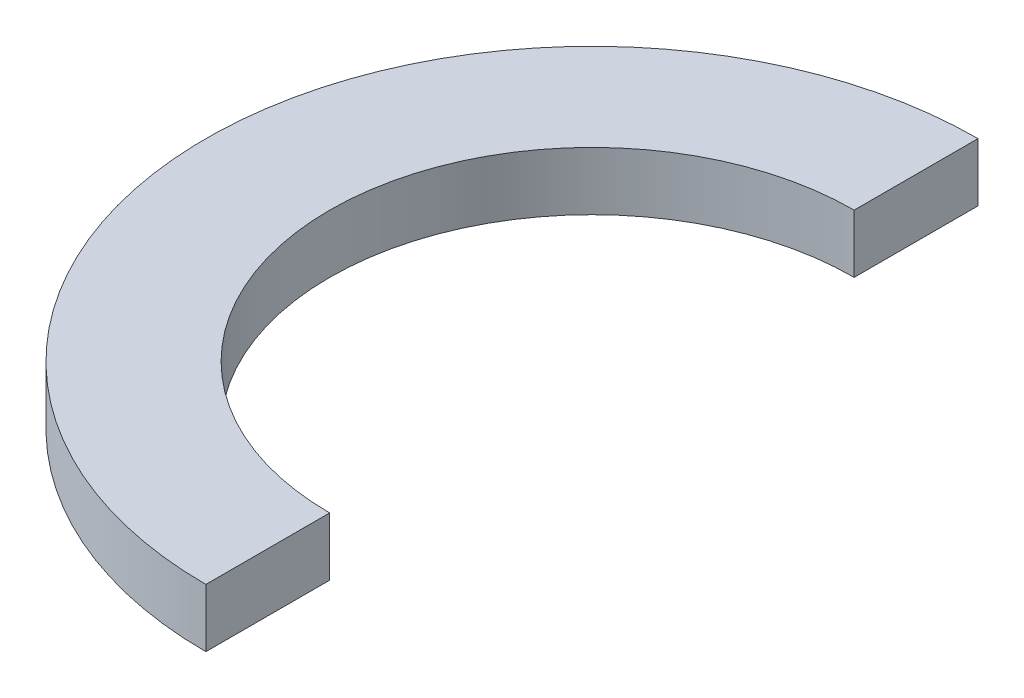
ISO-10303-21;
HEADER;
FILE_DESCRIPTION(('STEP AP214'),'2;1');
FILE_NAME('part.step','',(''),(''),'','','');
FILE_SCHEMA(('AUTOMOTIVE_DESIGN { 1 0 10303 214 1 1 1 1 }'));
ENDSEC;
DATA;
#1=APPLICATION_CONTEXT('core data for automotive mechanical design processes');
#2=APPLICATION_PROTOCOL_DEFINITION('international standard','automotive_design',2000,#1);
#3=PRODUCT_CONTEXT('',#1,'mechanical');
#4=PRODUCT('Part','Part','',(#3));
#5=PRODUCT_RELATED_PRODUCT_CATEGORY('part','',(#4));
#6=PRODUCT_DEFINITION_FORMATION('','',#4);
#7=PRODUCT_DEFINITION_CONTEXT('part definition',#1,'design');
#8=PRODUCT_DEFINITION('design','',#6,#7);
#9=PRODUCT_DEFINITION_SHAPE('','',#8);
#10=(LENGTH_UNIT() NAMED_UNIT(*) SI_UNIT(.MILLI.,.METRE.));
#11=(NAMED_UNIT(*) PLANE_ANGLE_UNIT() SI_UNIT($,.RADIAN.));
#12=(NAMED_UNIT(*) SI_UNIT($,.STERADIAN.) SOLID_ANGLE_UNIT());
#13=UNCERTAINTY_MEASURE_WITH_UNIT(LENGTH_MEASURE(1.E-05),#10,'distance_accuracy_value','');
#14=(GEOMETRIC_REPRESENTATION_CONTEXT(3) GLOBAL_UNCERTAINTY_ASSIGNED_CONTEXT((#13)) GLOBAL_UNIT_ASSIGNED_CONTEXT((#10,
#11,#12)) REPRESENTATION_CONTEXT('',''));
#15=CARTESIAN_POINT('',(0.,0.,0.));
#16=DIRECTION('',(0.,0.,1.));
#17=DIRECTION('',(1.,0.,0.));
#18=AXIS2_PLACEMENT_3D('',#15,#16,#17);
#19=CARTESIAN_POINT('',(65.,143.,100.));
#20=DIRECTION('',(0.,1.,0.));
#21=DIRECTION('',(1.,0.,0.));
#22=AXIS2_PLACEMENT_3D('',#19,#20,#21);
#23=CYLINDRICAL_SURFACE('',#22,3.6);
#24=CARTESIAN_POINT('',(65.,143.9,100.));
#25=DIRECTION('',(0.,-1.,0.));
#26=DIRECTION('',(1.,0.,0.));
#27=AXIS2_PLACEMENT_3D('',#24,#25,#26);
#28=CIRCLE('',#27,3.6);
#29=CARTESIAN_POINT('',(65.,143.9,103.6));
#30=VERTEX_POINT('',#29);
#31=CARTESIAN_POINT('',(65.,143.9,96.4));
#32=VERTEX_POINT('',#31);
#33=EDGE_CURVE('E72',#30,#32,#28,.T.);
#34=ORIENTED_EDGE('',*,*,#33,.F.);
#35=DIRECTION('',(0.,1.,0.));
#36=VECTOR('',#35,1.);
#37=CARTESIAN_POINT('',(65.,143.,103.6));
#38=LINE('',#37,#36);
#39=CARTESIAN_POINT('',(65.,143.1,103.6));
#40=VERTEX_POINT('',#39);
#41=EDGE_CURVE('E11',#40,#30,#38,.T.);
#42=ORIENTED_EDGE('',*,*,#41,.F.);
#43=CARTESIAN_POINT('',(65.,143.1,100.));
#44=DIRECTION('',(0.,-1.,0.));
#45=DIRECTION('',(1.,0.,0.));
#46=AXIS2_PLACEMENT_3D('',#43,#44,#45);
#47=CIRCLE('',#46,3.6);
#48=CARTESIAN_POINT('',(65.,143.1,96.4));
#49=VERTEX_POINT('',#48);
#50=EDGE_CURVE('E25',#40,#49,#47,.T.);
#51=ORIENTED_EDGE('',*,*,#50,.T.);
#52=DIRECTION('',(0.,1.,0.));
#53=VECTOR('',#52,1.);
#54=CARTESIAN_POINT('',(65.,143.,96.4));
#55=LINE('',#54,#53);
#56=EDGE_CURVE('E77',#49,#32,#55,.T.);
#57=ORIENTED_EDGE('',*,*,#56,.T.);
#58=EDGE_LOOP('',(#34,#42,#51,#57));
#59=FACE_BOUND('',#58,.T.);
#60=ADVANCED_FACE('F16',(#59),#23,.F.);
#61=CARTESIAN_POINT('',(65.,144.5,94.));
#62=DIRECTION('',(1.,0.,0.));
#63=DIRECTION('',(0.,1.,0.));
#64=AXIS2_PLACEMENT_3D('',#61,#62,#63);
#65=PLANE('',#64);
#66=ORIENTED_EDGE('',*,*,#41,.T.);
#67=DIRECTION('',(0.,0.,1.));
#68=VECTOR('',#67,1.);
#69=CARTESIAN_POINT('',(65.,143.9,97.));
#70=LINE('',#69,#68);
#71=CARTESIAN_POINT('',(65.,143.9,105.3));
#72=VERTEX_POINT('',#71);
#73=EDGE_CURVE('E66',#30,#72,#70,.T.);
#74=ORIENTED_EDGE('',*,*,#73,.T.);
#75=DIRECTION('',(0.,1.,0.));
#76=VECTOR('',#75,1.);
#77=CARTESIAN_POINT('',(65.,143.1,105.3));
#78=LINE('',#77,#76);
#79=CARTESIAN_POINT('',(65.,143.1,105.3));
#80=VERTEX_POINT('',#79);
#81=EDGE_CURVE('E88',#80,#72,#78,.T.);
#82=ORIENTED_EDGE('',*,*,#81,.F.);
#83=DIRECTION('',(0.,0.,1.));
#84=VECTOR('',#83,1.);
#85=CARTESIAN_POINT('',(65.,143.1,97.));
#86=LINE('',#85,#84);
#87=EDGE_CURVE('E68',#40,#80,#86,.T.);
#88=ORIENTED_EDGE('',*,*,#87,.F.);
#89=EDGE_LOOP('',(#66,#74,#82,#88));
#90=FACE_BOUND('',#89,.T.);
#91=ADVANCED_FACE('F18',(#90),#65,.T.);
#92=CARTESIAN_POINT('',(65.,143.1,100.));
#93=DIRECTION('',(0.,1.,0.));
#94=DIRECTION('',(0.,0.,-1.));
#95=AXIS2_PLACEMENT_3D('',#92,#93,#94);
#96=PLANE('',#95);
#97=ORIENTED_EDGE('',*,*,#87,.T.);
#98=CARTESIAN_POINT('',(65.,143.1,100.));
#99=DIRECTION('',(0.,-1.,0.));
#100=DIRECTION('',(1.,0.,0.));
#101=AXIS2_PLACEMENT_3D('',#98,#99,#100);
#102=CIRCLE('',#101,5.3);
#103=CARTESIAN_POINT('',(65.,143.1,94.7));
#104=VERTEX_POINT('',#103);
#105=EDGE_CURVE('E157',#80,#104,#102,.T.);
#106=ORIENTED_EDGE('',*,*,#105,.T.);
#107=DIRECTION('',(0.,0.,1.));
#108=VECTOR('',#107,1.);
#109=CARTESIAN_POINT('',(65.,143.1,97.));
#110=LINE('',#109,#108);
#111=EDGE_CURVE('E93',#104,#49,#110,.T.);
#112=ORIENTED_EDGE('',*,*,#111,.T.);
#113=ORIENTED_EDGE('',*,*,#50,.F.);
#114=EDGE_LOOP('',(#97,#106,#112,#113));
#115=FACE_BOUND('',#114,.T.);
#116=ADVANCED_FACE('F131',(#115),#96,.F.);
#117=CARTESIAN_POINT('',(65.,144.5,94.));
#118=DIRECTION('',(1.,0.,0.));
#119=DIRECTION('',(0.,1.,0.));
#120=AXIS2_PLACEMENT_3D('',#117,#118,#119);
#121=PLANE('',#120);
#122=DIRECTION('',(0.,0.,1.));
#123=VECTOR('',#122,1.);
#124=CARTESIAN_POINT('',(65.,143.9,97.));
#125=LINE('',#124,#123);
#126=CARTESIAN_POINT('',(65.,143.9,94.7));
#127=VERTEX_POINT('',#126);
#128=EDGE_CURVE('E78',#127,#32,#125,.T.);
#129=ORIENTED_EDGE('',*,*,#128,.T.);
#130=ORIENTED_EDGE('',*,*,#56,.F.);
#131=ORIENTED_EDGE('',*,*,#111,.F.);
#132=DIRECTION('',(0.,1.,0.));
#133=VECTOR('',#132,1.);
#134=CARTESIAN_POINT('',(65.,143.1,94.7));
#135=LINE('',#134,#133);
#136=EDGE_CURVE('E153',#104,#127,#135,.T.);
#137=ORIENTED_EDGE('',*,*,#136,.T.);
#138=EDGE_LOOP('',(#129,#130,#131,#137));
#139=FACE_BOUND('',#138,.T.);
#140=ADVANCED_FACE('F123',(#139),#121,.T.);
#141=CARTESIAN_POINT('',(65.,143.9,100.));
#142=DIRECTION('',(0.,1.,0.));
#143=DIRECTION('',(0.,0.,-1.));
#144=AXIS2_PLACEMENT_3D('',#141,#142,#143);
#145=PLANE('',#144);
#146=ORIENTED_EDGE('',*,*,#33,.T.);
#147=ORIENTED_EDGE('',*,*,#128,.F.);
#148=CARTESIAN_POINT('',(65.,143.9,100.));
#149=DIRECTION('',(0.,-1.,0.));
#150=DIRECTION('',(1.,0.,0.));
#151=AXIS2_PLACEMENT_3D('',#148,#149,#150);
#152=CIRCLE('',#151,5.3);
#153=EDGE_CURVE('E74',#72,#127,#152,.T.);
#154=ORIENTED_EDGE('',*,*,#153,.F.);
#155=ORIENTED_EDGE('',*,*,#73,.F.);
#156=EDGE_LOOP('',(#146,#147,#154,#155));
#157=FACE_BOUND('',#156,.T.);
#158=ADVANCED_FACE('F71',(#157),#145,.T.);
#159=CARTESIAN_POINT('',(65.,143.1,100.));
#160=DIRECTION('',(0.,1.,0.));
#161=DIRECTION('',(1.,0.,0.));
#162=AXIS2_PLACEMENT_3D('',#159,#160,#161);
#163=CYLINDRICAL_SURFACE('',#162,5.3);
#164=ORIENTED_EDGE('',*,*,#136,.F.);
#165=ORIENTED_EDGE('',*,*,#105,.F.);
#166=ORIENTED_EDGE('',*,*,#81,.T.);
#167=ORIENTED_EDGE('',*,*,#153,.T.);
#168=EDGE_LOOP('',(#164,#165,#166,#167));
#169=FACE_BOUND('',#168,.T.);
#170=ADVANCED_FACE('F102',(#169),#163,.T.);
#171=CLOSED_SHELL('',(#60,#91,#116,#140,#158,#170));
#172=MANIFOLD_SOLID_BREP('B1',#171);
#173=ADVANCED_BREP_SHAPE_REPRESENTATION('',(#18,#172),#14);
#174=SHAPE_DEFINITION_REPRESENTATION(#9,#173);
ENDSEC;
END-ISO-10303-21;
